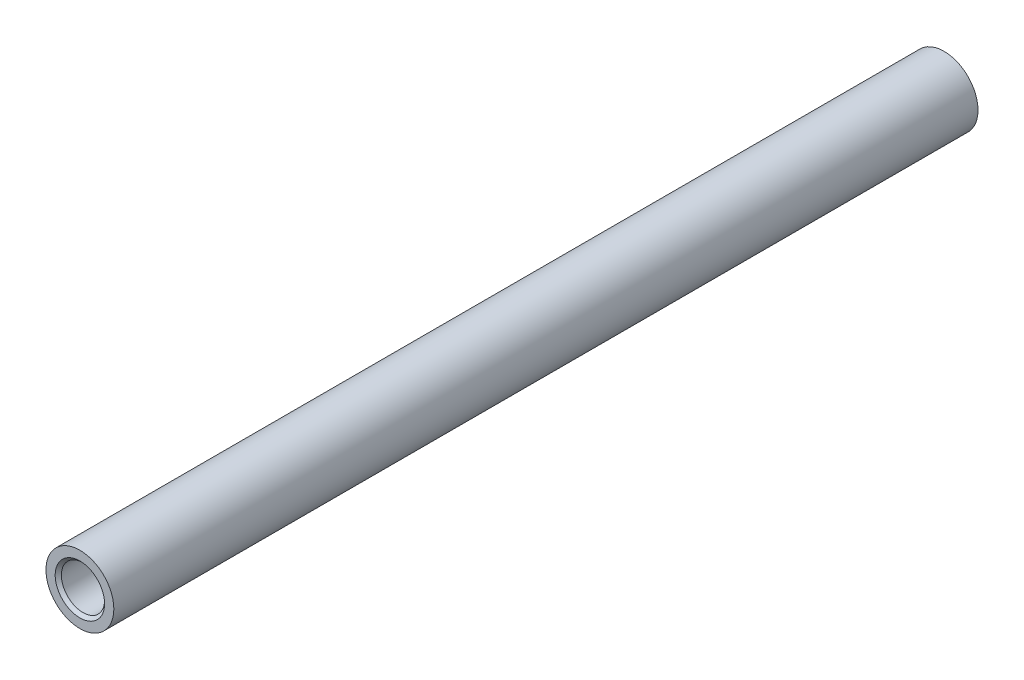
ISO-10303-21;
HEADER;
FILE_DESCRIPTION(('STEP AP214'),'2;1');
FILE_NAME('part.step','',(''),(''),'','','');
FILE_SCHEMA(('AUTOMOTIVE_DESIGN { 1 0 10303 214 1 1 1 1 }'));
ENDSEC;
DATA;
#1=APPLICATION_CONTEXT('core data for automotive mechanical design processes');
#2=APPLICATION_PROTOCOL_DEFINITION('international standard','automotive_design',2000,#1);
#3=PRODUCT_CONTEXT('',#1,'mechanical');
#4=PRODUCT('Part','Part','',(#3));
#5=PRODUCT_RELATED_PRODUCT_CATEGORY('part','',(#4));
#6=PRODUCT_DEFINITION_FORMATION('','',#4);
#7=PRODUCT_DEFINITION_CONTEXT('part definition',#1,'design');
#8=PRODUCT_DEFINITION('design','',#6,#7);
#9=PRODUCT_DEFINITION_SHAPE('','',#8);
#10=(LENGTH_UNIT() NAMED_UNIT(*) SI_UNIT(.MILLI.,.METRE.));
#11=(NAMED_UNIT(*) PLANE_ANGLE_UNIT() SI_UNIT($,.RADIAN.));
#12=(NAMED_UNIT(*) SI_UNIT($,.STERADIAN.) SOLID_ANGLE_UNIT());
#13=UNCERTAINTY_MEASURE_WITH_UNIT(LENGTH_MEASURE(1.E-05),#10,'distance_accuracy_value','');
#14=(GEOMETRIC_REPRESENTATION_CONTEXT(3) GLOBAL_UNCERTAINTY_ASSIGNED_CONTEXT((#13)) GLOBAL_UNIT_ASSIGNED_CONTEXT((#10,
#11,#12)) REPRESENTATION_CONTEXT('',''));
#15=CARTESIAN_POINT('',(0.,0.,0.));
#16=DIRECTION('',(0.,0.,1.));
#17=DIRECTION('',(1.,0.,0.));
#18=AXIS2_PLACEMENT_3D('',#15,#16,#17);
#19=CARTESIAN_POINT('',(0.,0.,140.));
#20=DIRECTION('',(0.,0.,-1.));
#21=DIRECTION('',(-1.,0.,0.));
#22=AXIS2_PLACEMENT_3D('',#19,#20,#21);
#23=CYLINDRICAL_SURFACE('',#22,7.);
#24=CARTESIAN_POINT('',(0.,0.,139.));
#25=DIRECTION('',(0.,0.,1.));
#26=DIRECTION('',(1.,0.,0.));
#27=AXIS2_PLACEMENT_3D('',#24,#25,#26);
#28=CIRCLE('',#27,7.);
#29=CARTESIAN_POINT('',(7.,0.,139.));
#30=VERTEX_POINT('',#29);
#31=EDGE_CURVE('E42',#30,#30,#28,.T.);
#32=ORIENTED_EDGE('',*,*,#31,.T.);
#33=EDGE_LOOP('',(#32));
#34=FACE_BOUND('',#33,.T.);
#35=CARTESIAN_POINT('',(0.,0.,-90.));
#36=DIRECTION('',(0.,0.,-1.));
#37=DIRECTION('',(-1.,0.,0.));
#38=AXIS2_PLACEMENT_3D('',#35,#36,#37);
#39=CIRCLE('',#38,7.);
#40=CARTESIAN_POINT('',(-7.,0.,-90.));
#41=VERTEX_POINT('',#40);
#42=EDGE_CURVE('E53',#41,#41,#39,.T.);
#43=ORIENTED_EDGE('',*,*,#42,.T.);
#44=EDGE_LOOP('',(#43));
#45=FACE_BOUND('',#44,.T.);
#46=ADVANCED_FACE('F34',(#34,#45),#23,.F.);
#47=CARTESIAN_POINT('',(0.,0.,140.));
#48=DIRECTION('',(0.,0.,1.));
#49=DIRECTION('',(1.,0.,0.));
#50=AXIS2_PLACEMENT_3D('',#47,#48,#49);
#51=PLANE('',#50);
#52=CARTESIAN_POINT('',(0.,0.,140.));
#53=DIRECTION('',(0.,0.,1.));
#54=DIRECTION('',(1.,0.,0.));
#55=AXIS2_PLACEMENT_3D('',#52,#53,#54);
#56=CIRCLE('',#55,7.99999999999998);
#57=CARTESIAN_POINT('',(7.99999999999998,0.,140.));
#58=VERTEX_POINT('',#57);
#59=EDGE_CURVE('E10',#58,#58,#56,.F.);
#60=ORIENTED_EDGE('',*,*,#59,.T.);
#61=EDGE_LOOP('',(#60));
#62=FACE_BOUND('',#61,.T.);
#63=CARTESIAN_POINT('',(0.,0.,140.));
#64=DIRECTION('',(0.,0.,1.));
#65=DIRECTION('',(1.,0.,0.));
#66=AXIS2_PLACEMENT_3D('',#63,#64,#65);
#67=CIRCLE('',#66,11.);
#68=CARTESIAN_POINT('',(11.,0.,140.));
#69=VERTEX_POINT('',#68);
#70=EDGE_CURVE('E46',#69,#69,#67,.T.);
#71=ORIENTED_EDGE('',*,*,#70,.T.);
#72=EDGE_LOOP('',(#71));
#73=FACE_BOUND('',#72,.T.);
#74=ADVANCED_FACE('F77',(#62,#73),#51,.T.);
#75=CARTESIAN_POINT('',(0.,0.,-140.));
#76=DIRECTION('',(0.,0.,1.));
#77=DIRECTION('',(1.,0.,0.));
#78=AXIS2_PLACEMENT_3D('',#75,#76,#77);
#79=PLANE('',#78);
#80=CARTESIAN_POINT('',(0.,0.,-140.));
#81=DIRECTION('',(0.,0.,-1.));
#82=DIRECTION('',(-1.,0.,0.));
#83=AXIS2_PLACEMENT_3D('',#80,#81,#82);
#84=CIRCLE('',#83,8.);
#85=CARTESIAN_POINT('',(-8.,0.,-140.));
#86=VERTEX_POINT('',#85);
#87=EDGE_CURVE('E59',#86,#86,#84,.T.);
#88=ORIENTED_EDGE('',*,*,#87,.F.);
#89=EDGE_LOOP('',(#88));
#90=FACE_BOUND('',#89,.T.);
#91=CARTESIAN_POINT('',(0.,0.,-140.));
#92=DIRECTION('',(0.,0.,1.));
#93=DIRECTION('',(1.,0.,0.));
#94=AXIS2_PLACEMENT_3D('',#91,#92,#93);
#95=CIRCLE('',#94,11.);
#96=CARTESIAN_POINT('',(11.,0.,-140.));
#97=VERTEX_POINT('',#96);
#98=EDGE_CURVE('E50',#97,#97,#95,.T.);
#99=ORIENTED_EDGE('',*,*,#98,.F.);
#100=EDGE_LOOP('',(#99));
#101=FACE_BOUND('',#100,.T.);
#102=ADVANCED_FACE('F74',(#90,#101),#79,.F.);
#103=CARTESIAN_POINT('',(0.,0.,140.));
#104=DIRECTION('',(0.,0.,-1.));
#105=DIRECTION('',(-1.,0.,0.));
#106=AXIS2_PLACEMENT_3D('',#103,#104,#105);
#107=CYLINDRICAL_SURFACE('',#106,11.);
#108=ORIENTED_EDGE('',*,*,#70,.F.);
#109=EDGE_LOOP('',(#108));
#110=FACE_BOUND('',#109,.T.);
#111=ORIENTED_EDGE('',*,*,#98,.T.);
#112=EDGE_LOOP('',(#111));
#113=FACE_BOUND('',#112,.T.);
#114=ADVANCED_FACE('F70',(#110,#113),#107,.T.);
#115=CARTESIAN_POINT('',(0.,0.,-90.));
#116=DIRECTION('',(0.,0.,-1.));
#117=DIRECTION('',(-1.,0.,0.));
#118=AXIS2_PLACEMENT_3D('',#115,#116,#117);
#119=CYLINDRICAL_SURFACE('',#118,8.);
#120=CARTESIAN_POINT('',(0.,0.,-90.));
#121=DIRECTION('',(0.,0.,-1.));
#122=DIRECTION('',(-1.,0.,0.));
#123=AXIS2_PLACEMENT_3D('',#120,#121,#122);
#124=CIRCLE('',#123,8.);
#125=CARTESIAN_POINT('',(-8.,0.,-90.));
#126=VERTEX_POINT('',#125);
#127=EDGE_CURVE('E56',#126,#126,#124,.T.);
#128=ORIENTED_EDGE('',*,*,#127,.F.);
#129=EDGE_LOOP('',(#128));
#130=FACE_BOUND('',#129,.T.);
#131=ORIENTED_EDGE('',*,*,#87,.T.);
#132=EDGE_LOOP('',(#131));
#133=FACE_BOUND('',#132,.T.);
#134=ADVANCED_FACE('F67',(#130,#133),#119,.F.);
#135=CARTESIAN_POINT('',(0.,0.,-90.));
#136=DIRECTION('',(0.,0.,-1.));
#137=DIRECTION('',(-1.,0.,0.));
#138=AXIS2_PLACEMENT_3D('',#135,#136,#137);
#139=PLANE('',#138);
#140=ORIENTED_EDGE('',*,*,#42,.F.);
#141=EDGE_LOOP('',(#140));
#142=FACE_BOUND('',#141,.T.);
#143=ORIENTED_EDGE('',*,*,#127,.T.);
#144=EDGE_LOOP('',(#143));
#145=FACE_BOUND('',#144,.T.);
#146=ADVANCED_FACE('F65',(#142,#145),#139,.T.);
#147=CARTESIAN_POINT('',(0.,0.,139.));
#148=DIRECTION('',(0.,0.,1.));
#149=DIRECTION('',(1.,0.,0.));
#150=AXIS2_PLACEMENT_3D('',#147,#148,#149);
#151=CONICAL_SURFACE('',#150,7.,0.785398163397438);
#152=ORIENTED_EDGE('',*,*,#59,.F.);
#153=EDGE_LOOP('',(#152));
#154=FACE_BOUND('',#153,.T.);
#155=ORIENTED_EDGE('',*,*,#31,.F.);
#156=EDGE_LOOP('',(#155));
#157=FACE_BOUND('',#156,.T.);
#158=ADVANCED_FACE('F37',(#154,#157),#151,.F.);
#159=CLOSED_SHELL('',(#46,#74,#102,#114,#134,#146,#158));
#160=MANIFOLD_SOLID_BREP('B2',#159);
#161=ADVANCED_BREP_SHAPE_REPRESENTATION('',(#18,#160),#14);
#162=SHAPE_DEFINITION_REPRESENTATION(#9,#161);
ENDSEC;
END-ISO-10303-21;
